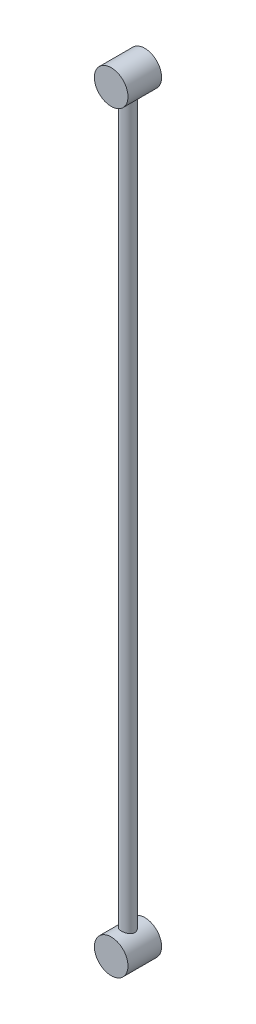
ISO-10303-21;
HEADER;
FILE_DESCRIPTION(('STEP AP214'),'2;1');
FILE_NAME('part.step','',(''),(''),'','','');
FILE_SCHEMA(('AUTOMOTIVE_DESIGN { 1 0 10303 214 1 1 1 1 }'));
ENDSEC;
DATA;
#1=APPLICATION_CONTEXT('core data for automotive mechanical design processes');
#2=APPLICATION_PROTOCOL_DEFINITION('international standard','automotive_design',2000,#1);
#3=PRODUCT_CONTEXT('',#1,'mechanical');
#4=PRODUCT('Part','Part','',(#3));
#5=PRODUCT_RELATED_PRODUCT_CATEGORY('part','',(#4));
#6=PRODUCT_DEFINITION_FORMATION('','',#4);
#7=PRODUCT_DEFINITION_CONTEXT('part definition',#1,'design');
#8=PRODUCT_DEFINITION('design','',#6,#7);
#9=PRODUCT_DEFINITION_SHAPE('','',#8);
#10=(LENGTH_UNIT() NAMED_UNIT(*) SI_UNIT(.MILLI.,.METRE.));
#11=(NAMED_UNIT(*) PLANE_ANGLE_UNIT() SI_UNIT($,.RADIAN.));
#12=(NAMED_UNIT(*) SI_UNIT($,.STERADIAN.) SOLID_ANGLE_UNIT());
#13=UNCERTAINTY_MEASURE_WITH_UNIT(LENGTH_MEASURE(1.E-05),#10,'distance_accuracy_value','');
#14=(GEOMETRIC_REPRESENTATION_CONTEXT(3) GLOBAL_UNCERTAINTY_ASSIGNED_CONTEXT((#13)) GLOBAL_UNIT_ASSIGNED_CONTEXT((#10,
#11,#12)) REPRESENTATION_CONTEXT('',''));
#15=CARTESIAN_POINT('',(0.,0.,0.));
#16=DIRECTION('',(0.,0.,1.));
#17=DIRECTION('',(1.,0.,0.));
#18=AXIS2_PLACEMENT_3D('',#15,#16,#17);
#19=CARTESIAN_POINT('',(-7.66603492320783,0.,-10.));
#20=DIRECTION('',(0.,0.,1.));
#21=DIRECTION('',(1.,0.,0.));
#22=AXIS2_PLACEMENT_3D('',#19,#20,#21);
#23=CYLINDRICAL_SURFACE('',#22,10.);
#24=CARTESIAN_POINT('',(-7.66603492320783,-10.,3.98820793018264));
#25=CARTESIAN_POINT('',(-7.77329250859179,-9.99999887143619,3.98820635783728));
#26=CARTESIAN_POINT('',(-7.88058371177644,-9.99826941368937,3.9838750126997));
#27=CARTESIAN_POINT('',(-8.09440640880557,-9.99139425384442,3.96658808791051));
#28=CARTESIAN_POINT('',(-8.20093737684072,-9.98624638262774,3.95362703235235));
#29=CARTESIAN_POINT('',(-8.41264488513136,-9.97265453793039,3.919170178775));
#30=CARTESIAN_POINT('',(-8.51781797356666,-9.96420341621136,3.8976558697628));
#31=CARTESIAN_POINT('',(-8.72583080260332,-9.94423363998175,3.846314429105));
#32=CARTESIAN_POINT('',(-8.82866957809732,-9.93271374089948,3.81648392451875));
#33=CARTESIAN_POINT('',(-9.13186496776464,-9.89406795398943,3.71515050506929));
#34=CARTESIAN_POINT('',(-9.32783476772868,-9.86279211194207,3.63165129097894));
#35=CARTESIAN_POINT('',(-9.70270805291919,-9.79226569941339,3.43549152430087));
#36=CARTESIAN_POINT('',(-9.88161748524673,-9.75301792292503,3.32284118478087));
#37=CARTESIAN_POINT('',(-10.2260677727126,-9.66845346834117,3.06596039916272));
#38=CARTESIAN_POINT('',(-10.3907107800039,-9.62294913183959,2.92058625924378));
#39=CARTESIAN_POINT('',(-10.6940318256138,-9.53186113045133,2.60480659022747));
#40=CARTESIAN_POINT('',(-10.8326972260926,-9.48627743778593,2.43438894928858));
#41=CARTESIAN_POINT('',(-11.0861694307877,-9.39795260468427,2.06421185688964));
#42=CARTESIAN_POINT('',(-11.1996513548775,-9.35542605032912,1.8634886583327));
#43=CARTESIAN_POINT('',(-11.390841016195,-9.28097119819073,1.44385355058227));
#44=CARTESIAN_POINT('',(-11.4685656446128,-9.24903789831149,1.22495028718052));
#45=CARTESIAN_POINT('',(-11.5824046868229,-9.20139785604963,0.785496537388475));
#46=CARTESIAN_POINT('',(-11.6202394246219,-9.18502355580332,0.565466703338906));
#47=CARTESIAN_POINT('',(-11.6585985295255,-9.1684196251672,0.121618932742807));
#48=CARTESIAN_POINT('',(-11.6591410954831,-9.16818211990392,-0.10219710276773));
#49=CARTESIAN_POINT('',(-11.6242048289449,-9.18330884070193,-0.530770660628449));
#50=CARTESIAN_POINT('',(-11.591212925316,-9.19759593021842,-0.735776301539047));
#51=CARTESIAN_POINT('',(-11.4942891827547,-9.23835503938607,-1.1370552836343));
#52=CARTESIAN_POINT('',(-11.4303519801801,-9.26482917133649,-1.33332710457393));
#53=CARTESIAN_POINT('',(-11.2721381032508,-9.32755923356961,-1.71628496054819));
#54=CARTESIAN_POINT('',(-11.1772706947312,-9.36400319832803,-1.90269476859386));
#55=CARTESIAN_POINT('',(-10.9603039417071,-9.44251440952346,-2.25763148736048));
#56=CARTESIAN_POINT('',(-10.8381944073776,-9.48458375775095,-2.42615167162722));
#57=CARTESIAN_POINT('',(-10.5591846897151,-9.57354140276466,-2.75414611360923));
#58=CARTESIAN_POINT('',(-10.400332699392,-9.62055164774966,-2.91193141789119));
#59=CARTESIAN_POINT('',(-10.057920096662,-9.71134552652944,-3.19916163873041));
#60=CARTESIAN_POINT('',(-9.87435463229409,-9.75512852410465,-3.32860097702429));
#61=CARTESIAN_POINT('',(-9.4829586154576,-9.83562001120123,-3.5576638673095));
#62=CARTESIAN_POINT('',(-9.27472407873295,-9.87217358300392,-3.65665553642845));
#63=CARTESIAN_POINT('',(-8.84273059265999,-9.93291746706356,-3.81762311906957));
#64=CARTESIAN_POINT('',(-8.61897954531948,-9.9571140205532,-3.87961772159256));
#65=CARTESIAN_POINT('',(-8.17646424563541,-9.98928202723972,-3.96142376960143));
#66=CARTESIAN_POINT('',(-7.95818278604257,-9.99812536837424,-3.98350518049171));
#67=CARTESIAN_POINT('',(-7.52087554338822,-10.0013344845359,-3.99155622231996));
#68=CARTESIAN_POINT('',(-7.30184996634618,-9.99570398496925,-3.97753514563666));
#69=CARTESIAN_POINT('',(-6.87953764533919,-9.97116900527506,-3.91545109285132));
#70=CARTESIAN_POINT('',(-6.67598466287158,-9.95286787708706,-3.86893461492449));
#71=CARTESIAN_POINT('',(-6.27975864057858,-9.90545713217046,-3.7452811781587));
#72=CARTESIAN_POINT('',(-6.08708700331792,-9.87634612573558,-3.66814028218946));
#73=CARTESIAN_POINT('',(-5.71147285955643,-9.80903783910806,-3.48291262054915));
#74=CARTESIAN_POINT('',(-5.52900724771597,-9.77059019402142,-3.37395263884167));
#75=CARTESIAN_POINT('',(-5.18431021296943,-9.68878097878094,-3.12914942140329));
#76=CARTESIAN_POINT('',(-5.02208691414176,-9.64541744891919,-2.99329544821565));
#77=CARTESIAN_POINT('',(-4.71131042543288,-9.55497248833229,-2.68810105499508));
#78=CARTESIAN_POINT('',(-4.56435343506716,-9.50783384754066,-2.51714795465809));
#79=CARTESIAN_POINT('',(-4.30082462308842,-9.4177919182889,-2.15216897367011));
#80=CARTESIAN_POINT('',(-4.18425768669008,-9.37488931146092,-1.95813939075526));
#81=CARTESIAN_POINT('',(-3.98411335937319,-9.29812387857013,-1.54965669298138));
#82=CARTESIAN_POINT('',(-3.90085609146252,-9.26434973935503,-1.33502887422747));
#83=CARTESIAN_POINT('',(-3.77230488012354,-9.21106946313078,-0.893047638631848));
#84=CARTESIAN_POINT('',(-3.72698314212181,-9.19155288124229,-0.665703669171361));
#85=CARTESIAN_POINT('',(-3.67823623581412,-9.17050167985476,-0.222284211018944));
#86=CARTESIAN_POINT('',(-3.67204356263044,-9.16777958114363,-0.00656742473002374));
#87=CARTESIAN_POINT('',(-3.6944715488212,-9.17751784801471,0.42267768154112));
#88=CARTESIAN_POINT('',(-3.72308784576195,-9.18997631109356,0.636206272377171));
#89=CARTESIAN_POINT('',(-3.81206688854263,-9.22762732790646,1.04646757466786));
#90=CARTESIAN_POINT('',(-3.87114525532741,-9.25230319667662,1.24353055839121));
#91=CARTESIAN_POINT('',(-4.0181707141166,-9.31124750687329,1.62502739312488));
#92=CARTESIAN_POINT('',(-4.10612576836914,-9.34551859363141,1.80945774393352));
#93=CARTESIAN_POINT('',(-4.31421617722594,-9.42222101069049,2.17191902668546));
#94=CARTESIAN_POINT('',(-4.43590097356168,-9.46500630674876,2.34898482502588));
#95=CARTESIAN_POINT('',(-4.70568555724659,-9.55282522914527,2.68103767326833));
#96=CARTESIAN_POINT('',(-4.8537932204905,-9.59785952295498,2.83601811531863));
#97=CARTESIAN_POINT('',(-5.18371179258746,-9.6886041077367,3.12979861459257));
#98=CARTESIAN_POINT('',(-5.36707735128506,-9.7341717130838,3.26691780162307));
#99=CARTESIAN_POINT('',(-5.6584460787768,-9.79691510418524,3.44797590985844));
#100=CARTESIAN_POINT('',(-5.75837852282364,-9.81690911555301,3.5042615232562));
#101=CARTESIAN_POINT('',(-5.96307010727205,-9.85447656156412,3.6081659407308));
#102=CARTESIAN_POINT('',(-6.06782701099833,-9.87205110312178,3.65578871130875));
#103=CARTESIAN_POINT('',(-6.27950021841143,-9.90397769825388,3.74113806095041));
#104=CARTESIAN_POINT('',(-6.38634219720338,-9.91838271970445,3.77902941857474));
#105=CARTESIAN_POINT('',(-6.60317794767371,-9.94395503052142,3.84564571419583));
#106=CARTESIAN_POINT('',(-6.71317022417675,-9.95512382875422,3.87437492461035));
#107=CARTESIAN_POINT('',(-6.93521007625973,-9.97387990016374,3.92231665333562));
#108=CARTESIAN_POINT('',(-7.04725167671489,-9.98147625904055,3.94155332002288));
#109=CARTESIAN_POINT('',(-7.27270126666109,-9.99289780872269,3.97038887966885));
#110=CARTESIAN_POINT('',(-7.38610822166902,-9.99672569261225,3.97999465529022));
#111=CARTESIAN_POINT('',(-7.55511780849872,-9.99953902248286,3.98705180147284));
#112=CARTESIAN_POINT('',(-7.61057187125586,-10.000000583582,3.98820874324469));
#113=CARTESIAN_POINT('',(-7.66603492320783,-10.,3.98820793018264));
#114=B_SPLINE_CURVE_WITH_KNOTS('',3,(#24,#25,#26,#27,#28,#29,#30,#31,#32,#33,#34,#35,#36,#37,
#38,#39,#40,#41,#42,#43,#44,#45,#46,#47,#48,#49,#50,#51,#52,#53,#54,#55,#56,#57,#58,#59,#60,#61,
#62,#63,#64,#65,#66,#67,#68,#69,#70,#71,#72,#73,#74,#75,#76,#77,#78,#79,#80,#81,#82,#83,#84,#85,
#86,#87,#88,#89,#90,#91,#92,#93,#94,#95,#96,#97,#98,#99,#100,#101,#102,#103,#104,#105,#106,#107,
#108,#109,#110,#111,#112,#113),.UNSPECIFIED.,.T.,.F.,(4,2,2,2,2,2,2,2,2,2,2,2,2,2,2,2,2,2,2,2,2,
2,2,2,2,2,2,2,2,2,2,2,2,2,2,2,2,2,2,2,2,2,2,2,4),(0.,0.321729409832449,0.643663165029046,
0.966297477075261,1.28906283625262,1.93178271353046,2.57427771868391,3.24422533008793,
3.9144980225567,4.61438615000336,5.31394332084722,5.98191414623074,6.64955899464437,
7.2710613953621,7.89267155755243,8.5269270884812,9.1614202594952,9.84464711568349,
10.5280083049642,11.2247196474958,11.9210787490002,12.5764133202717,13.2315792325761,
13.8575184465737,14.4835381585163,15.1286783699933,15.7740766758051,16.4618377580722,
17.1497093301651,17.8440414481117,18.5378643969508,19.1820085429809,19.8260719699717,
20.4449649491442,21.0640287208942,21.7184051365324,22.3729769297928,23.0696323664596,
23.4185380090904,23.7672834921271,24.1096628984454,24.4518824149507,24.7932268018803,
25.134327074696,25.3006938161077),.UNSPECIFIED.);
#115=CARTESIAN_POINT('',(-7.66603492320783,-10.,3.98820793018264));
#116=VERTEX_POINT('',#115);
#117=EDGE_CURVE('E49',#116,#116,#114,.T.);
#118=ORIENTED_EDGE('',*,*,#117,.F.);
#119=EDGE_LOOP('',(#118));
#120=FACE_BOUND('',#119,.T.);
#121=CARTESIAN_POINT('',(-7.66603492320783,0.,-10.));
#122=DIRECTION('',(0.,0.,1.));
#123=DIRECTION('',(1.,0.,0.));
#124=AXIS2_PLACEMENT_3D('',#121,#122,#123);
#125=CIRCLE('',#124,10.);
#126=CARTESIAN_POINT('',(2.33396507679217,0.,-10.));
#127=VERTEX_POINT('',#126);
#128=EDGE_CURVE('E53',#127,#127,#125,.T.);
#129=ORIENTED_EDGE('',*,*,#128,.T.);
#130=EDGE_LOOP('',(#129));
#131=FACE_BOUND('',#130,.T.);
#132=CARTESIAN_POINT('',(-7.66603492320783,0.,10.));
#133=DIRECTION('',(0.,0.,1.));
#134=DIRECTION('',(1.,0.,0.));
#135=AXIS2_PLACEMENT_3D('',#132,#133,#134);
#136=CIRCLE('',#135,10.);
#137=CARTESIAN_POINT('',(2.33396507679217,0.,10.));
#138=VERTEX_POINT('',#137);
#139=EDGE_CURVE('E57',#138,#138,#136,.T.);
#140=ORIENTED_EDGE('',*,*,#139,.F.);
#141=EDGE_LOOP('',(#140));
#142=FACE_BOUND('',#141,.T.);
#143=ADVANCED_FACE('F37',(#120,#131,#142),#23,.T.);
#144=CARTESIAN_POINT('',(-7.66603492320783,0.,-10.));
#145=DIRECTION('',(0.,0.,1.));
#146=DIRECTION('',(1.,0.,0.));
#147=AXIS2_PLACEMENT_3D('',#144,#145,#146);
#148=PLANE('',#147);
#149=ORIENTED_EDGE('',*,*,#128,.F.);
#150=EDGE_LOOP('',(#149));
#151=FACE_BOUND('',#150,.T.);
#152=ADVANCED_FACE('F74',(#151),#148,.F.);
#153=CARTESIAN_POINT('',(-7.66603492320783,0.,10.));
#154=DIRECTION('',(0.,0.,1.));
#155=DIRECTION('',(1.,0.,0.));
#156=AXIS2_PLACEMENT_3D('',#153,#154,#155);
#157=PLANE('',#156);
#158=ORIENTED_EDGE('',*,*,#139,.T.);
#159=EDGE_LOOP('',(#158));
#160=FACE_BOUND('',#159,.T.);
#161=ADVANCED_FACE('F68',(#160),#157,.T.);
#162=CARTESIAN_POINT('',(-7.66603492320783,-450.,0.));
#163=DIRECTION('',(0.,1.,0.));
#164=DIRECTION('',(0.,0.,1.));
#165=AXIS2_PLACEMENT_3D('',#162,#163,#164);
#166=CYLINDRICAL_SURFACE('',#165,3.98820793018264);
#167=CARTESIAN_POINT('',(-7.66603492320783,-438.,3.98820793018264));
#168=CARTESIAN_POINT('',(-7.77329250859179,-438.000001128564,3.98820635783728));
#169=CARTESIAN_POINT('',(-7.88058371177644,-438.001730586311,3.9838750126997));
#170=CARTESIAN_POINT('',(-8.09440640880557,-438.008605746156,3.96658808791051));
#171=CARTESIAN_POINT('',(-8.20093737684072,-438.013753617372,3.95362703235235));
#172=CARTESIAN_POINT('',(-8.41264488513136,-438.02734546207,3.919170178775));
#173=CARTESIAN_POINT('',(-8.51781797356666,-438.035796583789,3.8976558697628));
#174=CARTESIAN_POINT('',(-8.72583080260332,-438.055766360018,3.846314429105));
#175=CARTESIAN_POINT('',(-8.82866957809732,-438.067286259101,3.81648392451875));
#176=CARTESIAN_POINT('',(-9.13186496776464,-438.105932046011,3.71515050506929));
#177=CARTESIAN_POINT('',(-9.32783476772869,-438.137207888058,3.63165129097894));
#178=CARTESIAN_POINT('',(-9.7027080529192,-438.207734300587,3.43549152430087));
#179=CARTESIAN_POINT('',(-9.88161748524674,-438.246982077075,3.32284118478087));
#180=CARTESIAN_POINT('',(-10.2260677727126,-438.331546531659,3.06596039916271));
#181=CARTESIAN_POINT('',(-10.3907107800039,-438.37705086816,2.92058625924378));
#182=CARTESIAN_POINT('',(-10.6940318256138,-438.468138869549,2.60480659022747));
#183=CARTESIAN_POINT('',(-10.8326972260926,-438.513722562214,2.43438894928858));
#184=CARTESIAN_POINT('',(-11.0861694307877,-438.602047395316,2.06421185688964));
#185=CARTESIAN_POINT('',(-11.1996513548775,-438.644573949671,1.8634886583327));
#186=CARTESIAN_POINT('',(-11.390841016195,-438.719028801809,1.44385355058226));
#187=CARTESIAN_POINT('',(-11.4685656446128,-438.750962101689,1.22495028718052));
#188=CARTESIAN_POINT('',(-11.5824046868229,-438.79860214395,0.78549653738847));
#189=CARTESIAN_POINT('',(-11.6202394246219,-438.814976444197,0.565466703338902));
#190=CARTESIAN_POINT('',(-11.6585985295255,-438.831580374833,0.121618932742804));
#191=CARTESIAN_POINT('',(-11.6591410954831,-438.831817880096,-0.102197102767733));
#192=CARTESIAN_POINT('',(-11.6242048289449,-438.816691159298,-0.530770660628448));
#193=CARTESIAN_POINT('',(-11.591212925316,-438.802404069782,-0.735776301539044));
#194=CARTESIAN_POINT('',(-11.4942891827547,-438.761644960614,-1.1370552836343));
#195=CARTESIAN_POINT('',(-11.4303519801801,-438.735170828664,-1.33332710457393));
#196=CARTESIAN_POINT('',(-11.2721381032508,-438.67244076643,-1.71628496054819));
#197=CARTESIAN_POINT('',(-11.1772706947312,-438.635996801672,-1.90269476859386));
#198=CARTESIAN_POINT('',(-10.9603039417071,-438.557485590477,-2.25763148736048));
#199=CARTESIAN_POINT('',(-10.8381944073776,-438.515416242249,-2.42615167162721));
#200=CARTESIAN_POINT('',(-10.5591846897151,-438.426458597235,-2.75414611360923));
#201=CARTESIAN_POINT('',(-10.400332699392,-438.37944835225,-2.91193141789118));
#202=CARTESIAN_POINT('',(-10.057920096662,-438.288654473471,-3.1991616387304));
#203=CARTESIAN_POINT('',(-9.87435463229409,-438.244871475895,-3.32860097702429));
#204=CARTESIAN_POINT('',(-9.4829586154576,-438.164379988799,-3.5576638673095));
#205=CARTESIAN_POINT('',(-9.27472407873296,-438.127826416996,-3.65665553642845));
#206=CARTESIAN_POINT('',(-8.84273059265999,-438.067082532936,-3.81762311906957));
#207=CARTESIAN_POINT('',(-8.61897954531949,-438.042885979447,-3.87961772159256));
#208=CARTESIAN_POINT('',(-8.17646424563542,-438.01071797276,-3.96142376960143));
#209=CARTESIAN_POINT('',(-7.95818278604258,-438.001874631626,-3.98350518049171));
#210=CARTESIAN_POINT('',(-7.52087554338823,-437.998665515464,-3.99155622231996));
#211=CARTESIAN_POINT('',(-7.30184996634619,-438.004296015031,-3.97753514563666));
#212=CARTESIAN_POINT('',(-6.8795376453392,-438.028830994725,-3.91545109285132));
#213=CARTESIAN_POINT('',(-6.67598466287158,-438.047132122913,-3.86893461492449));
#214=CARTESIAN_POINT('',(-6.27975864057858,-438.09454286783,-3.7452811781587));
#215=CARTESIAN_POINT('',(-6.08708700331792,-438.123653874264,-3.66814028218946));
#216=CARTESIAN_POINT('',(-5.71147285955644,-438.190962160892,-3.48291262054915));
#217=CARTESIAN_POINT('',(-5.52900724771597,-438.229409805979,-3.37395263884167));
#218=CARTESIAN_POINT('',(-5.18431021296943,-438.311219021219,-3.12914942140329));
#219=CARTESIAN_POINT('',(-5.02208691414176,-438.354582551081,-2.99329544821564));
#220=CARTESIAN_POINT('',(-4.71131042543288,-438.445027511668,-2.68810105499508));
#221=CARTESIAN_POINT('',(-4.56435343506717,-438.492166152459,-2.51714795465809));
#222=CARTESIAN_POINT('',(-4.30082462308843,-438.582208081711,-2.15216897367012));
#223=CARTESIAN_POINT('',(-4.18425768669009,-438.625110688539,-1.95813939075527));
#224=CARTESIAN_POINT('',(-3.98411335937319,-438.70187612143,-1.54965669298138));
#225=CARTESIAN_POINT('',(-3.90085609146252,-438.735650260645,-1.33502887422747));
#226=CARTESIAN_POINT('',(-3.77230488012354,-438.788930536869,-0.893047638631845));
#227=CARTESIAN_POINT('',(-3.72698314212181,-438.808447118758,-0.665703669171361));
#228=CARTESIAN_POINT('',(-3.67823623581412,-438.829498320145,-0.222284211018947));
#229=CARTESIAN_POINT('',(-3.67204356263044,-438.832220418856,-0.00656742473002702));
#230=CARTESIAN_POINT('',(-3.6944715488212,-438.822482151985,0.422677681541117));
#231=CARTESIAN_POINT('',(-3.72308784576195,-438.810023688906,0.636206272377169));
#232=CARTESIAN_POINT('',(-3.81206688854263,-438.772372672094,1.04646757466786));
#233=CARTESIAN_POINT('',(-3.87114525532741,-438.747696803323,1.24353055839121));
#234=CARTESIAN_POINT('',(-4.0181707141166,-438.688752493127,1.62502739312488));
#235=CARTESIAN_POINT('',(-4.10612576836915,-438.654481406369,1.80945774393352));
#236=CARTESIAN_POINT('',(-4.31421617722594,-438.577778989309,2.17191902668547));
#237=CARTESIAN_POINT('',(-4.43590097356168,-438.534993693251,2.34898482502588));
#238=CARTESIAN_POINT('',(-4.7056855572466,-438.447174770855,2.68103767326833));
#239=CARTESIAN_POINT('',(-4.8537932204905,-438.402140477045,2.83601811531863));
#240=CARTESIAN_POINT('',(-5.18371179258747,-438.311395892263,3.12979861459257));
#241=CARTESIAN_POINT('',(-5.36707735128506,-438.265828286916,3.26691780162307));
#242=CARTESIAN_POINT('',(-5.6584460787768,-438.203084895815,3.44797590985844));
#243=CARTESIAN_POINT('',(-5.75837852282364,-438.183090884447,3.5042615232562));
#244=CARTESIAN_POINT('',(-5.96307010727206,-438.145523438436,3.6081659407308));
#245=CARTESIAN_POINT('',(-6.06782701099834,-438.127948896878,3.65578871130875));
#246=CARTESIAN_POINT('',(-6.27950021841144,-438.096022301746,3.74113806095041));
#247=CARTESIAN_POINT('',(-6.38634219720339,-438.081617280296,3.77902941857474));
#248=CARTESIAN_POINT('',(-6.60317794767372,-438.056044969479,3.84564571419583));
#249=CARTESIAN_POINT('',(-6.71317022417676,-438.044876171246,3.87437492461035));
#250=CARTESIAN_POINT('',(-6.93521007625974,-438.026120099836,3.92231665333562));
#251=CARTESIAN_POINT('',(-7.04725167671489,-438.018523740959,3.94155332002288));
#252=CARTESIAN_POINT('',(-7.27270126666109,-438.007102191277,3.97038887966885));
#253=CARTESIAN_POINT('',(-7.38610822166903,-438.003274307388,3.97999465529022));
#254=CARTESIAN_POINT('',(-7.55511780849872,-438.000460977517,3.98705180147284));
#255=CARTESIAN_POINT('',(-7.61057187125586,-437.999999416418,3.98820874324469));
#256=CARTESIAN_POINT('',(-7.66603492320783,-438.,3.98820793018264));
#257=B_SPLINE_CURVE_WITH_KNOTS('',3,(#167,#168,#169,#170,#171,#172,#173,#174,#175,#176,#177,
#178,#179,#180,#181,#182,#183,#184,#185,#186,#187,#188,#189,#190,#191,#192,#193,#194,#195,#196,
#197,#198,#199,#200,#201,#202,#203,#204,#205,#206,#207,#208,#209,#210,#211,#212,#213,#214,#215,
#216,#217,#218,#219,#220,#221,#222,#223,#224,#225,#226,#227,#228,#229,#230,#231,#232,#233,#234,
#235,#236,#237,#238,#239,#240,#241,#242,#243,#244,#245,#246,#247,#248,#249,#250,#251,#252,#253,
#254,#255,#256),.UNSPECIFIED.,.T.,.F.,(4,2,2,2,2,2,2,2,2,2,2,2,2,2,2,2,2,2,2,2,2,2,2,2,2,2,2,2,
2,2,2,2,2,2,2,2,2,2,2,2,2,2,2,2,4),(0.,0.321729409832449,0.643663165029046,0.966297477075258,
1.28906283625263,1.93178271353047,2.57427771868392,3.24422533008794,3.9144980225567,
4.61438615000336,5.31394332084723,5.98191414623075,6.64955899464437,7.27106139536211,
7.89267155755242,8.52692708848121,9.16142025949519,9.84464711568347,10.5280083049642,
11.2247196474958,11.9210787490002,12.5764133202717,13.2315792325761,13.8575184465737,
14.4835381585163,15.1286783699933,15.7740766758051,16.4618377580722,17.1497093301651,
17.8440414481117,18.5378643969508,19.1820085429809,19.8260719699717,20.4449649491442,
21.0640287208942,21.7184051365324,22.3729769297928,23.0696323664596,23.4185380090904,
23.7672834921271,24.1096628984454,24.4518824149507,24.7932268018803,25.134327074696,
25.3006938161077),.UNSPECIFIED.);
#258=CARTESIAN_POINT('',(-7.66603492320783,-438.,3.98820793018264));
#259=VERTEX_POINT('',#258);
#260=EDGE_CURVE('E10',#259,#259,#257,.T.);
#261=ORIENTED_EDGE('',*,*,#260,.F.);
#262=EDGE_LOOP('',(#261));
#263=FACE_BOUND('',#262,.T.);
#264=ORIENTED_EDGE('',*,*,#117,.T.);
#265=EDGE_LOOP('',(#264));
#266=FACE_BOUND('',#265,.T.);
#267=ADVANCED_FACE('F63',(#263,#266),#166,.T.);
#268=CARTESIAN_POINT('',(-7.66603492320783,-448.,-10.));
#269=DIRECTION('',(0.,0.,1.));
#270=DIRECTION('',(1.,0.,0.));
#271=AXIS2_PLACEMENT_3D('',#268,#269,#270);
#272=CYLINDRICAL_SURFACE('',#271,10.);
#273=ORIENTED_EDGE('',*,*,#260,.T.);
#274=EDGE_LOOP('',(#273));
#275=FACE_BOUND('',#274,.T.);
#276=CARTESIAN_POINT('',(-7.66603492320783,-448.,-10.));
#277=DIRECTION('',(0.,0.,-1.));
#278=DIRECTION('',(1.,0.,0.));
#279=AXIS2_PLACEMENT_3D('',#276,#277,#278);
#280=CIRCLE('',#279,10.);
#281=CARTESIAN_POINT('',(2.33396507679217,-448.,-10.));
#282=VERTEX_POINT('',#281);
#283=EDGE_CURVE('E87',#282,#282,#280,.T.);
#284=ORIENTED_EDGE('',*,*,#283,.F.);
#285=EDGE_LOOP('',(#284));
#286=FACE_BOUND('',#285,.T.);
#287=CARTESIAN_POINT('',(-7.66603492320783,-448.,10.));
#288=DIRECTION('',(0.,0.,-1.));
#289=DIRECTION('',(1.,0.,0.));
#290=AXIS2_PLACEMENT_3D('',#287,#288,#289);
#291=CIRCLE('',#290,10.);
#292=CARTESIAN_POINT('',(2.33396507679217,-448.,10.));
#293=VERTEX_POINT('',#292);
#294=EDGE_CURVE('E89',#293,#293,#291,.T.);
#295=ORIENTED_EDGE('',*,*,#294,.T.);
#296=EDGE_LOOP('',(#295));
#297=FACE_BOUND('',#296,.T.);
#298=ADVANCED_FACE('F67',(#275,#286,#297),#272,.T.);
#299=CARTESIAN_POINT('',(-7.66603492320783,-448.,-10.));
#300=DIRECTION('',(0.,0.,1.));
#301=DIRECTION('',(1.,0.,0.));
#302=AXIS2_PLACEMENT_3D('',#299,#300,#301);
#303=PLANE('',#302);
#304=ORIENTED_EDGE('',*,*,#283,.T.);
#305=EDGE_LOOP('',(#304));
#306=FACE_BOUND('',#305,.T.);
#307=ADVANCED_FACE('F98',(#306),#303,.F.);
#308=CARTESIAN_POINT('',(-7.66603492320783,-448.,10.));
#309=DIRECTION('',(0.,0.,1.));
#310=DIRECTION('',(1.,0.,0.));
#311=AXIS2_PLACEMENT_3D('',#308,#309,#310);
#312=PLANE('',#311);
#313=ORIENTED_EDGE('',*,*,#294,.F.);
#314=EDGE_LOOP('',(#313));
#315=FACE_BOUND('',#314,.T.);
#316=ADVANCED_FACE('F96',(#315),#312,.T.);
#317=CLOSED_SHELL('',(#143,#152,#161,#267,#298,#307,#316));
#318=MANIFOLD_SOLID_BREP('B2',#317);
#319=ADVANCED_BREP_SHAPE_REPRESENTATION('',(#18,#318),#14);
#320=SHAPE_DEFINITION_REPRESENTATION(#9,#319);
ENDSEC;
END-ISO-10303-21;
